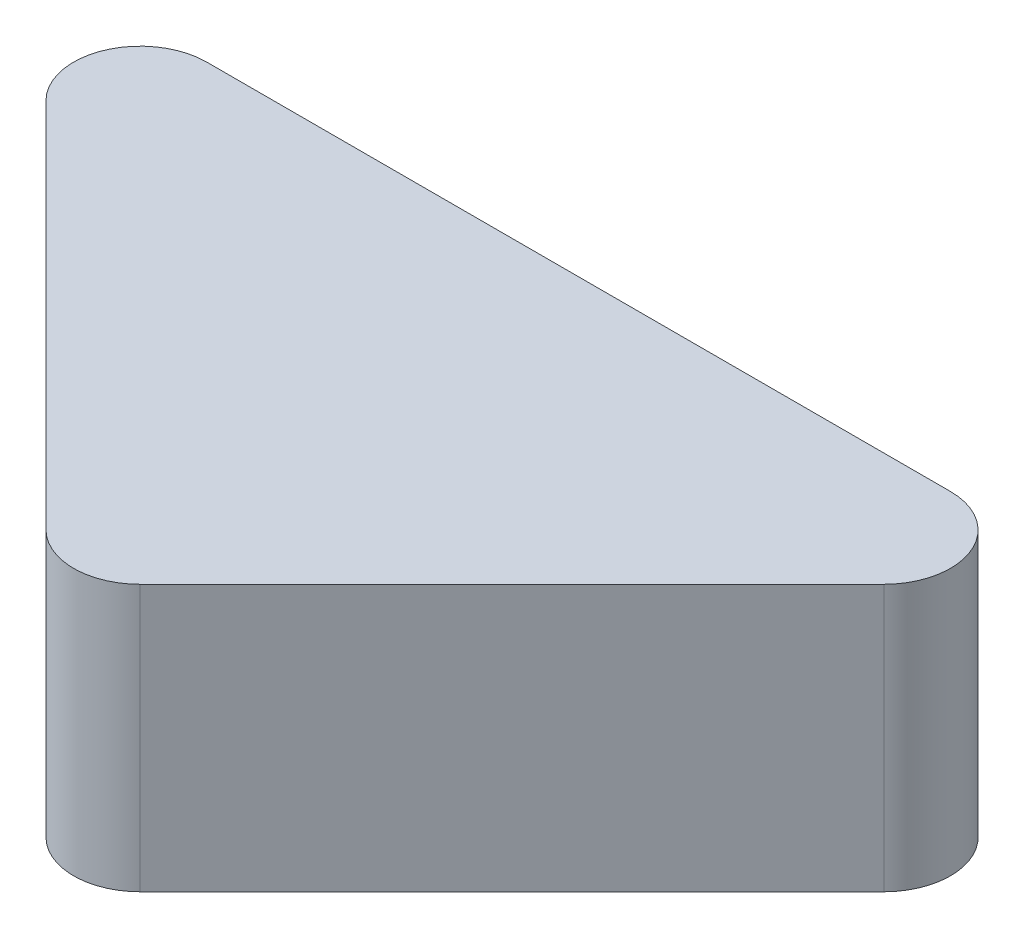
ISO-10303-21;
HEADER;
FILE_DESCRIPTION(('STEP AP214'),'2;1');
FILE_NAME('part.step','',(''),(''),'','','');
FILE_SCHEMA(('AUTOMOTIVE_DESIGN { 1 0 10303 214 1 1 1 1 }'));
ENDSEC;
DATA;
#1=APPLICATION_CONTEXT('core data for automotive mechanical design processes');
#2=APPLICATION_PROTOCOL_DEFINITION('international standard','automotive_design',2000,#1);
#3=PRODUCT_CONTEXT('',#1,'mechanical');
#4=PRODUCT('Part','Part','',(#3));
#5=PRODUCT_RELATED_PRODUCT_CATEGORY('part','',(#4));
#6=PRODUCT_DEFINITION_FORMATION('','',#4);
#7=PRODUCT_DEFINITION_CONTEXT('part definition',#1,'design');
#8=PRODUCT_DEFINITION('design','',#6,#7);
#9=PRODUCT_DEFINITION_SHAPE('','',#8);
#10=(LENGTH_UNIT() NAMED_UNIT(*) SI_UNIT(.MILLI.,.METRE.));
#11=(NAMED_UNIT(*) PLANE_ANGLE_UNIT() SI_UNIT($,.RADIAN.));
#12=(NAMED_UNIT(*) SI_UNIT($,.STERADIAN.) SOLID_ANGLE_UNIT());
#13=UNCERTAINTY_MEASURE_WITH_UNIT(LENGTH_MEASURE(1.E-05),#10,'distance_accuracy_value','');
#14=(GEOMETRIC_REPRESENTATION_CONTEXT(3) GLOBAL_UNCERTAINTY_ASSIGNED_CONTEXT((#13)) GLOBAL_UNIT_ASSIGNED_CONTEXT((#10,
#11,#12)) REPRESENTATION_CONTEXT('',''));
#15=CARTESIAN_POINT('',(0.,0.,0.));
#16=DIRECTION('',(0.,0.,1.));
#17=DIRECTION('',(1.,0.,0.));
#18=AXIS2_PLACEMENT_3D('',#15,#16,#17);
#19=CARTESIAN_POINT('',(0.,25.4,0.));
#20=DIRECTION('',(0.707106781186548,0.,-0.707106781186548));
#21=DIRECTION('',(-0.707106781186548,0.,-0.707106781186548));
#22=AXIS2_PLACEMENT_3D('',#19,#20,#21);
#23=PLANE('',#22);
#24=DIRECTION('',(0.707106781186547,0.,0.707106781186547));
#25=VECTOR('',#24,1.);
#26=CARTESIAN_POINT('',(0.,25.4,0.));
#27=LINE('',#26,#25);
#28=CARTESIAN_POINT('',(-39.9598719394654,25.4,-39.9598719394654));
#29=VERTEX_POINT('',#28);
#30=CARTESIAN_POINT('',(-4.49012806053458,25.4,-4.49012806053458));
#31=VERTEX_POINT('',#30);
#32=EDGE_CURVE('E112',#29,#31,#27,.T.);
#33=ORIENTED_EDGE('',*,*,#32,.F.);
#34=DIRECTION('',(0.,-1.,0.));
#35=VECTOR('',#34,1.);
#36=CARTESIAN_POINT('',(-39.9598719394654,25.4,-39.9598719394654));
#37=LINE('',#36,#35);
#38=CARTESIAN_POINT('',(-39.9598719394654,0.,-39.9598719394654));
#39=VERTEX_POINT('',#38);
#40=EDGE_CURVE('E97',#29,#39,#37,.T.);
#41=ORIENTED_EDGE('',*,*,#40,.T.);
#42=DIRECTION('',(0.707106781186547,0.,0.707106781186547));
#43=VECTOR('',#42,1.);
#44=CARTESIAN_POINT('',(0.,0.,0.));
#45=LINE('',#44,#43);
#46=CARTESIAN_POINT('',(-4.49012806053458,0.,-4.49012806053458));
#47=VERTEX_POINT('',#46);
#48=EDGE_CURVE('E110',#39,#47,#45,.T.);
#49=ORIENTED_EDGE('',*,*,#48,.T.);
#50=DIRECTION('',(0.,-1.,0.));
#51=VECTOR('',#50,1.);
#52=CARTESIAN_POINT('',(-4.49012806053458,25.4,-4.49012806053458));
#53=LINE('',#52,#51);
#54=EDGE_CURVE('E115',#47,#31,#53,.F.);
#55=ORIENTED_EDGE('',*,*,#54,.T.);
#56=EDGE_LOOP('',(#33,#41,#49,#55));
#57=FACE_BOUND('',#56,.T.);
#58=ADVANCED_FACE('F39',(#57),#23,.F.);
#59=CARTESIAN_POINT('',(0.,25.4,0.));
#60=DIRECTION('',(-0.707106781186547,0.,-0.707106781186548));
#61=DIRECTION('',(-0.707106781186548,0.,0.707106781186547));
#62=AXIS2_PLACEMENT_3D('',#59,#60,#61);
#63=PLANE('',#62);
#64=DIRECTION('',(0.707106781186548,0.,-0.707106781186547));
#65=VECTOR('',#64,1.);
#66=CARTESIAN_POINT('',(0.,0.,0.));
#67=LINE('',#66,#65);
#68=CARTESIAN_POINT('',(4.49012806053458,0.,-4.49012806053458));
#69=VERTEX_POINT('',#68);
#70=CARTESIAN_POINT('',(39.9598719394654,0.,-39.9598719394654));
#71=VERTEX_POINT('',#70);
#72=EDGE_CURVE('E120',#69,#71,#67,.T.);
#73=ORIENTED_EDGE('',*,*,#72,.T.);
#74=DIRECTION('',(0.,-1.,0.));
#75=VECTOR('',#74,1.);
#76=CARTESIAN_POINT('',(39.9598719394654,25.4,-39.9598719394654));
#77=LINE('',#76,#75);
#78=CARTESIAN_POINT('',(39.9598719394654,25.4,-39.9598719394654));
#79=VERTEX_POINT('',#78);
#80=EDGE_CURVE('E11',#71,#79,#77,.F.);
#81=ORIENTED_EDGE('',*,*,#80,.T.);
#82=DIRECTION('',(0.707106781186548,0.,-0.707106781186547));
#83=VECTOR('',#82,1.);
#84=CARTESIAN_POINT('',(0.,25.4,0.));
#85=LINE('',#84,#83);
#86=CARTESIAN_POINT('',(4.49012806053458,25.4,-4.49012806053458));
#87=VERTEX_POINT('',#86);
#88=EDGE_CURVE('E153',#87,#79,#85,.T.);
#89=ORIENTED_EDGE('',*,*,#88,.F.);
#90=DIRECTION('',(0.,-1.,0.));
#91=VECTOR('',#90,1.);
#92=CARTESIAN_POINT('',(4.49012806053458,25.4,-4.49012806053458));
#93=LINE('',#92,#91);
#94=EDGE_CURVE('E48',#87,#69,#93,.T.);
#95=ORIENTED_EDGE('',*,*,#94,.T.);
#96=EDGE_LOOP('',(#73,#81,#89,#95));
#97=FACE_BOUND('',#96,.T.);
#98=ADVANCED_FACE('F152',(#97),#63,.F.);
#99=CARTESIAN_POINT('',(-50.8,25.4,-50.8));
#100=DIRECTION('',(0.,0.,1.));
#101=DIRECTION('',(1.,0.,0.));
#102=AXIS2_PLACEMENT_3D('',#99,#100,#101);
#103=PLANE('',#102);
#104=DIRECTION('',(-1.,0.,0.));
#105=VECTOR('',#104,1.);
#106=CARTESIAN_POINT('',(-50.8,0.,-50.8));
#107=LINE('',#106,#105);
#108=CARTESIAN_POINT('',(35.4697438789309,0.,-50.8));
#109=VERTEX_POINT('',#108);
#110=CARTESIAN_POINT('',(-35.4697438789308,0.,-50.8));
#111=VERTEX_POINT('',#110);
#112=EDGE_CURVE('E123',#109,#111,#107,.T.);
#113=ORIENTED_EDGE('',*,*,#112,.T.);
#114=DIRECTION('',(0.,-1.,0.));
#115=VECTOR('',#114,1.);
#116=CARTESIAN_POINT('',(-35.4697438789308,25.4,-50.8));
#117=LINE('',#116,#115);
#118=CARTESIAN_POINT('',(-35.4697438789308,25.4,-50.8));
#119=VERTEX_POINT('',#118);
#120=EDGE_CURVE('E98',#111,#119,#117,.F.);
#121=ORIENTED_EDGE('',*,*,#120,.T.);
#122=DIRECTION('',(-1.,0.,0.));
#123=VECTOR('',#122,1.);
#124=CARTESIAN_POINT('',(-50.8,25.4,-50.8));
#125=LINE('',#124,#123);
#126=CARTESIAN_POINT('',(35.4697438789309,25.4,-50.8));
#127=VERTEX_POINT('',#126);
#128=EDGE_CURVE('E126',#127,#119,#125,.T.);
#129=ORIENTED_EDGE('',*,*,#128,.F.);
#130=DIRECTION('',(0.,-1.,0.));
#131=VECTOR('',#130,1.);
#132=CARTESIAN_POINT('',(35.4697438789309,25.4,-50.8));
#133=LINE('',#132,#131);
#134=EDGE_CURVE('E104',#127,#109,#133,.T.);
#135=ORIENTED_EDGE('',*,*,#134,.T.);
#136=EDGE_LOOP('',(#113,#121,#129,#135));
#137=FACE_BOUND('',#136,.T.);
#138=ADVANCED_FACE('F161',(#137),#103,.F.);
#139=CARTESIAN_POINT('',(0.,25.4,0.));
#140=DIRECTION('',(0.,-1.,0.));
#141=DIRECTION('',(0.,0.,-1.));
#142=AXIS2_PLACEMENT_3D('',#139,#140,#141);
#143=PLANE('',#142);
#144=ORIENTED_EDGE('',*,*,#128,.T.);
#145=CARTESIAN_POINT('',(-35.4697438789308,25.4,-44.45));
#146=DIRECTION('',(0.,-1.,0.));
#147=DIRECTION('',(0.,0.,-1.));
#148=AXIS2_PLACEMENT_3D('',#145,#146,#147);
#149=CIRCLE('',#148,6.35);
#150=EDGE_CURVE('E147',#119,#29,#149,.F.);
#151=ORIENTED_EDGE('',*,*,#150,.T.);
#152=ORIENTED_EDGE('',*,*,#32,.T.);
#153=CARTESIAN_POINT('',(0.,25.4,-8.98025612106915));
#154=DIRECTION('',(0.,-1.,0.));
#155=DIRECTION('',(0.,0.,-1.));
#156=AXIS2_PLACEMENT_3D('',#153,#154,#155);
#157=CIRCLE('',#156,6.35);
#158=EDGE_CURVE('E60',#31,#87,#157,.F.);
#159=ORIENTED_EDGE('',*,*,#158,.T.);
#160=ORIENTED_EDGE('',*,*,#88,.T.);
#161=CARTESIAN_POINT('',(35.4697438789309,25.4,-44.45));
#162=DIRECTION('',(0.,-1.,0.));
#163=DIRECTION('',(0.,0.,-1.));
#164=AXIS2_PLACEMENT_3D('',#161,#162,#163);
#165=CIRCLE('',#164,6.35);
#166=EDGE_CURVE('E144',#79,#127,#165,.F.);
#167=ORIENTED_EDGE('',*,*,#166,.T.);
#168=EDGE_LOOP('',(#144,#151,#152,#159,#160,#167));
#169=FACE_BOUND('',#168,.T.);
#170=ADVANCED_FACE('F167',(#169),#143,.F.);
#171=CARTESIAN_POINT('',(0.,0.,0.));
#172=DIRECTION('',(0.,-1.,0.));
#173=DIRECTION('',(0.,0.,-1.));
#174=AXIS2_PLACEMENT_3D('',#171,#172,#173);
#175=PLANE('',#174);
#176=ORIENTED_EDGE('',*,*,#48,.F.);
#177=CARTESIAN_POINT('',(-35.4697438789308,0.,-44.45));
#178=DIRECTION('',(0.,-1.,0.));
#179=DIRECTION('',(0.,0.,-1.));
#180=AXIS2_PLACEMENT_3D('',#177,#178,#179);
#181=CIRCLE('',#180,6.35);
#182=EDGE_CURVE('E93',#39,#111,#181,.T.);
#183=ORIENTED_EDGE('',*,*,#182,.T.);
#184=ORIENTED_EDGE('',*,*,#112,.F.);
#185=CARTESIAN_POINT('',(35.4697438789309,0.,-44.45));
#186=DIRECTION('',(0.,-1.,0.));
#187=DIRECTION('',(0.,0.,-1.));
#188=AXIS2_PLACEMENT_3D('',#185,#186,#187);
#189=CIRCLE('',#188,6.35);
#190=EDGE_CURVE('E105',#109,#71,#189,.T.);
#191=ORIENTED_EDGE('',*,*,#190,.T.);
#192=ORIENTED_EDGE('',*,*,#72,.F.);
#193=CARTESIAN_POINT('',(0.,0.,-8.98025612106915));
#194=DIRECTION('',(0.,-1.,0.));
#195=DIRECTION('',(0.,0.,-1.));
#196=AXIS2_PLACEMENT_3D('',#193,#194,#195);
#197=CIRCLE('',#196,6.35);
#198=EDGE_CURVE('E114',#69,#47,#197,.T.);
#199=ORIENTED_EDGE('',*,*,#198,.T.);
#200=EDGE_LOOP('',(#176,#183,#184,#191,#192,#199));
#201=FACE_BOUND('',#200,.T.);
#202=ADVANCED_FACE('F117',(#201),#175,.T.);
#203=CARTESIAN_POINT('',(-35.4697438789308,25.4,-44.45));
#204=DIRECTION('',(0.,-1.,0.));
#205=DIRECTION('',(0.,0.,-1.));
#206=AXIS2_PLACEMENT_3D('',#203,#204,#205);
#207=CYLINDRICAL_SURFACE('',#206,6.35);
#208=ORIENTED_EDGE('',*,*,#150,.F.);
#209=ORIENTED_EDGE('',*,*,#120,.F.);
#210=ORIENTED_EDGE('',*,*,#182,.F.);
#211=ORIENTED_EDGE('',*,*,#40,.F.);
#212=EDGE_LOOP('',(#208,#209,#210,#211));
#213=FACE_BOUND('',#212,.T.);
#214=ADVANCED_FACE('F96',(#213),#207,.T.);
#215=CARTESIAN_POINT('',(35.4697438789309,25.4,-44.45));
#216=DIRECTION('',(0.,-1.,0.));
#217=DIRECTION('',(0.,0.,-1.));
#218=AXIS2_PLACEMENT_3D('',#215,#216,#217);
#219=CYLINDRICAL_SURFACE('',#218,6.35);
#220=ORIENTED_EDGE('',*,*,#166,.F.);
#221=ORIENTED_EDGE('',*,*,#80,.F.);
#222=ORIENTED_EDGE('',*,*,#190,.F.);
#223=ORIENTED_EDGE('',*,*,#134,.F.);
#224=EDGE_LOOP('',(#220,#221,#222,#223));
#225=FACE_BOUND('',#224,.T.);
#226=ADVANCED_FACE('F158',(#225),#219,.T.);
#227=CARTESIAN_POINT('',(0.,25.4,-8.98025612106915));
#228=DIRECTION('',(0.,-1.,0.));
#229=DIRECTION('',(0.,0.,-1.));
#230=AXIS2_PLACEMENT_3D('',#227,#228,#229);
#231=CYLINDRICAL_SURFACE('',#230,6.35);
#232=ORIENTED_EDGE('',*,*,#158,.F.);
#233=ORIENTED_EDGE('',*,*,#54,.F.);
#234=ORIENTED_EDGE('',*,*,#198,.F.);
#235=ORIENTED_EDGE('',*,*,#94,.F.);
#236=EDGE_LOOP('',(#232,#233,#234,#235));
#237=FACE_BOUND('',#236,.T.);
#238=ADVANCED_FACE('F41',(#237),#231,.T.);
#239=CLOSED_SHELL('',(#58,#98,#138,#170,#202,#214,#226,#238));
#240=MANIFOLD_SOLID_BREP('B2',#239);
#241=ADVANCED_BREP_SHAPE_REPRESENTATION('',(#18,#240),#14);
#242=SHAPE_DEFINITION_REPRESENTATION(#9,#241);
ENDSEC;
END-ISO-10303-21;
